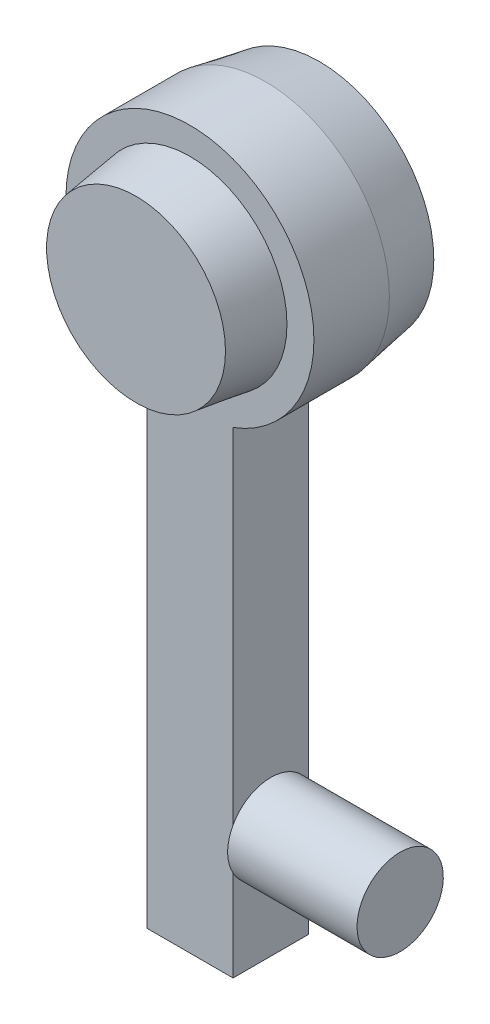
ISO-10303-21;
HEADER;
FILE_DESCRIPTION(('STEP AP214'),'2;1');
FILE_NAME('part.step','',(''),(''),'','','');
FILE_SCHEMA(('AUTOMOTIVE_DESIGN { 1 0 10303 214 1 1 1 1 }'));
ENDSEC;
DATA;
#1=APPLICATION_CONTEXT('core data for automotive mechanical design processes');
#2=APPLICATION_PROTOCOL_DEFINITION('international standard','automotive_design',2000,#1);
#3=PRODUCT_CONTEXT('',#1,'mechanical');
#4=PRODUCT('Part','Part','',(#3));
#5=PRODUCT_RELATED_PRODUCT_CATEGORY('part','',(#4));
#6=PRODUCT_DEFINITION_FORMATION('','',#4);
#7=PRODUCT_DEFINITION_CONTEXT('part definition',#1,'design');
#8=PRODUCT_DEFINITION('design','',#6,#7);
#9=PRODUCT_DEFINITION_SHAPE('','',#8);
#10=(LENGTH_UNIT() NAMED_UNIT(*) SI_UNIT(.MILLI.,.METRE.));
#11=(NAMED_UNIT(*) PLANE_ANGLE_UNIT() SI_UNIT($,.RADIAN.));
#12=(NAMED_UNIT(*) SI_UNIT($,.STERADIAN.) SOLID_ANGLE_UNIT());
#13=UNCERTAINTY_MEASURE_WITH_UNIT(LENGTH_MEASURE(1.E-05),#10,'distance_accuracy_value','');
#14=(GEOMETRIC_REPRESENTATION_CONTEXT(3) GLOBAL_UNCERTAINTY_ASSIGNED_CONTEXT((#13)) GLOBAL_UNIT_ASSIGNED_CONTEXT((#10,
#11,#12)) REPRESENTATION_CONTEXT('',''));
#15=CARTESIAN_POINT('',(0.,0.,0.));
#16=DIRECTION('',(0.,0.,1.));
#17=DIRECTION('',(1.,0.,0.));
#18=AXIS2_PLACEMENT_3D('',#15,#16,#17);
#19=CARTESIAN_POINT('',(4.,-10.7819293264239,-7.));
#20=DIRECTION('',(1.,0.,0.));
#21=DIRECTION('',(0.,1.,0.));
#22=AXIS2_PLACEMENT_3D('',#19,#20,#21);
#23=PLANE('',#22);
#24=DIRECTION('',(0.,1.,0.));
#25=VECTOR('',#24,1.);
#26=CARTESIAN_POINT('',(4.,-10.7819293264239,-7.));
#27=LINE('',#26,#25);
#28=CARTESIAN_POINT('',(4.00000000000001,-55.,-7.));
#29=VERTEX_POINT('',#28);
#30=CARTESIAN_POINT('',(4.00000000000001,-46.5764916731037,-7.));
#31=VERTEX_POINT('',#30);
#32=EDGE_CURVE('E115',#29,#31,#27,.T.);
#33=ORIENTED_EDGE('',*,*,#32,.T.);
#34=CARTESIAN_POINT('',(4.00000000000001,-44.64,-3.5));
#35=DIRECTION('',(1.,0.,0.));
#36=DIRECTION('',(0.,1.,0.));
#37=AXIS2_PLACEMENT_3D('',#34,#35,#36);
#38=CIRCLE('',#37,4.);
#39=CARTESIAN_POINT('',(4.00000000000001,-46.5764916731037,0.));
#40=VERTEX_POINT('',#39);
#41=EDGE_CURVE('E108',#40,#31,#38,.T.);
#42=ORIENTED_EDGE('',*,*,#41,.F.);
#43=DIRECTION('',(0.,1.,0.));
#44=VECTOR('',#43,1.);
#45=CARTESIAN_POINT('',(4.,-10.7819293264239,0.));
#46=LINE('',#45,#44);
#47=CARTESIAN_POINT('',(4.00000000000001,-55.,0.));
#48=VERTEX_POINT('',#47);
#49=EDGE_CURVE('E101',#48,#40,#46,.T.);
#50=ORIENTED_EDGE('',*,*,#49,.F.);
#51=DIRECTION('',(0.,0.,1.));
#52=VECTOR('',#51,1.);
#53=CARTESIAN_POINT('',(4.00000000000001,-55.,-7.));
#54=LINE('',#53,#52);
#55=EDGE_CURVE('E59',#29,#48,#54,.T.);
#56=ORIENTED_EDGE('',*,*,#55,.F.);
#57=EDGE_LOOP('',(#33,#42,#50,#56));
#58=FACE_BOUND('',#57,.T.);
#59=ADVANCED_FACE('F34',(#58),#23,.T.);
#60=CARTESIAN_POINT('',(0.,0.,-7.));
#61=DIRECTION('',(0.,0.,1.));
#62=DIRECTION('',(1.,0.,0.));
#63=AXIS2_PLACEMENT_3D('',#60,#61,#62);
#64=PLANE('',#63);
#65=CARTESIAN_POINT('',(0.,0.,-7.));
#66=DIRECTION('',(0.,0.,-1.));
#67=DIRECTION('',(-1.,0.,0.));
#68=AXIS2_PLACEMENT_3D('',#65,#66,#67);
#69=CIRCLE('',#68,11.5);
#70=CARTESIAN_POINT('',(4.,-10.7819293264239,-7.));
#71=VERTEX_POINT('',#70);
#72=CARTESIAN_POINT('',(-4.,-10.7819293264239,-7.));
#73=VERTEX_POINT('',#72);
#74=EDGE_CURVE('E86',#71,#73,#69,.T.);
#75=ORIENTED_EDGE('',*,*,#74,.F.);
#76=CARTESIAN_POINT('',(4.00000000000001,-42.7035083268963,-7.));
#77=VERTEX_POINT('',#76);
#78=EDGE_CURVE('E135',#77,#71,#27,.T.);
#79=ORIENTED_EDGE('',*,*,#78,.F.);
#80=DIRECTION('',(0.,1.,0.));
#81=VECTOR('',#80,1.);
#82=CARTESIAN_POINT('',(4.,0.,-7.));
#83=LINE('',#82,#81);
#84=EDGE_CURVE('E146',#31,#77,#83,.T.);
#85=ORIENTED_EDGE('',*,*,#84,.F.);
#86=ORIENTED_EDGE('',*,*,#32,.F.);
#87=DIRECTION('',(1.,0.,0.));
#88=VECTOR('',#87,1.);
#89=CARTESIAN_POINT('',(-3.99999999999999,-55.,-7.));
#90=LINE('',#89,#88);
#91=CARTESIAN_POINT('',(-3.99999999999999,-55.,-7.));
#92=VERTEX_POINT('',#91);
#93=EDGE_CURVE('E136',#92,#29,#90,.T.);
#94=ORIENTED_EDGE('',*,*,#93,.F.);
#95=DIRECTION('',(0.,-1.,0.));
#96=VECTOR('',#95,1.);
#97=CARTESIAN_POINT('',(-4.,-10.7819293264239,-7.));
#98=LINE('',#97,#96);
#99=EDGE_CURVE('E124',#73,#92,#98,.T.);
#100=ORIENTED_EDGE('',*,*,#99,.F.);
#101=EDGE_LOOP('',(#75,#79,#85,#86,#94,#100));
#102=FACE_BOUND('',#101,.T.);
#103=ADVANCED_FACE('F183',(#102),#64,.F.);
#104=CARTESIAN_POINT('',(0.,0.,-7.));
#105=DIRECTION('',(0.,0.,1.));
#106=DIRECTION('',(1.,0.,0.));
#107=AXIS2_PLACEMENT_3D('',#104,#105,#106);
#108=CYLINDRICAL_SURFACE('',#107,11.5);
#109=CARTESIAN_POINT('',(0.,0.,0.));
#110=DIRECTION('',(0.,0.,1.));
#111=DIRECTION('',(1.,0.,0.));
#112=AXIS2_PLACEMENT_3D('',#109,#110,#111);
#113=CIRCLE('',#112,11.5);
#114=CARTESIAN_POINT('',(4.,-10.7819293264239,0.));
#115=VERTEX_POINT('',#114);
#116=CARTESIAN_POINT('',(-4.,-10.7819293264239,0.));
#117=VERTEX_POINT('',#116);
#118=EDGE_CURVE('E129',#115,#117,#113,.T.);
#119=ORIENTED_EDGE('',*,*,#118,.F.);
#120=DIRECTION('',(0.,0.,1.));
#121=VECTOR('',#120,1.);
#122=CARTESIAN_POINT('',(4.,-10.7819293264239,-7.));
#123=LINE('',#122,#121);
#124=EDGE_CURVE('E43',#71,#115,#123,.T.);
#125=ORIENTED_EDGE('',*,*,#124,.F.);
#126=CARTESIAN_POINT('',(0.,0.,-7.));
#127=DIRECTION('',(0.,0.,1.));
#128=DIRECTION('',(1.,0.,0.));
#129=AXIS2_PLACEMENT_3D('',#126,#127,#128);
#130=CIRCLE('',#129,11.5);
#131=EDGE_CURVE('E122',#71,#73,#130,.T.);
#132=ORIENTED_EDGE('',*,*,#131,.T.);
#133=DIRECTION('',(0.,0.,1.));
#134=VECTOR('',#133,1.);
#135=CARTESIAN_POINT('',(-4.,-10.7819293264239,-7.));
#136=LINE('',#135,#134);
#137=EDGE_CURVE('E38',#73,#117,#136,.T.);
#138=ORIENTED_EDGE('',*,*,#137,.T.);
#139=EDGE_LOOP('',(#119,#125,#132,#138));
#140=FACE_BOUND('',#139,.T.);
#141=ADVANCED_FACE('F36',(#140),#108,.T.);
#142=CARTESIAN_POINT('',(4.00000000000001,-42.7035083268963,0.));
#143=VERTEX_POINT('',#142);
#144=EDGE_CURVE('E80',#143,#115,#46,.T.);
#145=ORIENTED_EDGE('',*,*,#144,.F.);
#146=EDGE_CURVE('E111',#77,#143,#38,.T.);
#147=ORIENTED_EDGE('',*,*,#146,.F.);
#148=ORIENTED_EDGE('',*,*,#78,.T.);
#149=ORIENTED_EDGE('',*,*,#124,.T.);
#150=EDGE_LOOP('',(#145,#147,#148,#149));
#151=FACE_BOUND('',#150,.T.);
#152=ADVANCED_FACE('F185',(#151),#23,.T.);
#153=CARTESIAN_POINT('',(-3.99999999999999,-55.,-7.));
#154=DIRECTION('',(0.,-1.,0.));
#155=DIRECTION('',(0.,0.,-1.));
#156=AXIS2_PLACEMENT_3D('',#153,#154,#155);
#157=PLANE('',#156);
#158=DIRECTION('',(1.,0.,0.));
#159=VECTOR('',#158,1.);
#160=CARTESIAN_POINT('',(-3.99999999999999,-55.,0.));
#161=LINE('',#160,#159);
#162=CARTESIAN_POINT('',(-3.99999999999999,-55.,0.));
#163=VERTEX_POINT('',#162);
#164=EDGE_CURVE('E121',#163,#48,#161,.T.);
#165=ORIENTED_EDGE('',*,*,#164,.F.);
#166=DIRECTION('',(0.,0.,1.));
#167=VECTOR('',#166,1.);
#168=CARTESIAN_POINT('',(-3.99999999999999,-55.,-7.));
#169=LINE('',#168,#167);
#170=EDGE_CURVE('E209',#92,#163,#169,.T.);
#171=ORIENTED_EDGE('',*,*,#170,.F.);
#172=ORIENTED_EDGE('',*,*,#93,.T.);
#173=ORIENTED_EDGE('',*,*,#55,.T.);
#174=EDGE_LOOP('',(#165,#171,#172,#173));
#175=FACE_BOUND('',#174,.T.);
#176=ADVANCED_FACE('F194',(#175),#157,.T.);
#177=CARTESIAN_POINT('',(-4.,-10.7819293264239,-7.));
#178=DIRECTION('',(-1.,0.,0.));
#179=DIRECTION('',(0.,-1.,0.));
#180=AXIS2_PLACEMENT_3D('',#177,#178,#179);
#181=PLANE('',#180);
#182=DIRECTION('',(0.,-1.,0.));
#183=VECTOR('',#182,1.);
#184=CARTESIAN_POINT('',(-4.,-10.7819293264239,0.));
#185=LINE('',#184,#183);
#186=EDGE_CURVE('E128',#117,#163,#185,.T.);
#187=ORIENTED_EDGE('',*,*,#186,.F.);
#188=ORIENTED_EDGE('',*,*,#137,.F.);
#189=ORIENTED_EDGE('',*,*,#99,.T.);
#190=ORIENTED_EDGE('',*,*,#170,.T.);
#191=EDGE_LOOP('',(#187,#188,#189,#190));
#192=FACE_BOUND('',#191,.T.);
#193=ADVANCED_FACE('F200',(#192),#181,.T.);
#194=CARTESIAN_POINT('',(0.,0.,0.));
#195=DIRECTION('',(0.,0.,1.));
#196=DIRECTION('',(1.,0.,0.));
#197=AXIS2_PLACEMENT_3D('',#194,#195,#196);
#198=PLANE('',#197);
#199=CARTESIAN_POINT('',(0.,0.,0.));
#200=DIRECTION('',(0.,0.,1.));
#201=DIRECTION('',(1.,0.,0.));
#202=AXIS2_PLACEMENT_3D('',#199,#200,#201);
#203=CIRCLE('',#202,9.);
#204=CARTESIAN_POINT('',(9.,0.,0.));
#205=VERTEX_POINT('',#204);
#206=EDGE_CURVE('E11',#205,#205,#203,.T.);
#207=ORIENTED_EDGE('',*,*,#206,.F.);
#208=EDGE_LOOP('',(#207));
#209=FACE_BOUND('',#208,.T.);
#210=ORIENTED_EDGE('',*,*,#118,.T.);
#211=ORIENTED_EDGE('',*,*,#186,.T.);
#212=ORIENTED_EDGE('',*,*,#164,.T.);
#213=ORIENTED_EDGE('',*,*,#49,.T.);
#214=EDGE_CURVE('E98',#40,#143,#46,.T.);
#215=ORIENTED_EDGE('',*,*,#214,.T.);
#216=ORIENTED_EDGE('',*,*,#144,.T.);
#217=EDGE_LOOP('',(#210,#211,#212,#213,#215,#216));
#218=FACE_BOUND('',#217,.T.);
#219=ADVANCED_FACE('F118',(#209,#218),#198,.T.);
#220=CARTESIAN_POINT('',(0.,0.,0.));
#221=DIRECTION('',(0.,0.,-1.));
#222=DIRECTION('',(1.,0.,0.));
#223=AXIS2_PLACEMENT_3D('',#220,#221,#222);
#224=CONICAL_SURFACE('',#223,9.,0.139626340159547);
#225=CARTESIAN_POINT('',(0.,0.,5.));
#226=DIRECTION('',(0.,0.,1.));
#227=DIRECTION('',(1.,0.,0.));
#228=AXIS2_PLACEMENT_3D('',#225,#226,#227);
#229=CIRCLE('',#228,8.29729582648804);
#230=CARTESIAN_POINT('',(8.29729582648804,0.,5.));
#231=VERTEX_POINT('',#230);
#232=EDGE_CURVE('E133',#231,#231,#229,.T.);
#233=ORIENTED_EDGE('',*,*,#232,.F.);
#234=EDGE_LOOP('',(#233));
#235=FACE_BOUND('',#234,.T.);
#236=ORIENTED_EDGE('',*,*,#206,.T.);
#237=EDGE_LOOP('',(#236));
#238=FACE_BOUND('',#237,.T.);
#239=ADVANCED_FACE('F179',(#235,#238),#224,.T.);
#240=CARTESIAN_POINT('',(0.,0.,5.));
#241=DIRECTION('',(0.,0.,1.));
#242=DIRECTION('',(1.,0.,0.));
#243=AXIS2_PLACEMENT_3D('',#240,#241,#242);
#244=PLANE('',#243);
#245=ORIENTED_EDGE('',*,*,#232,.T.);
#246=EDGE_LOOP('',(#245));
#247=FACE_BOUND('',#246,.T.);
#248=ADVANCED_FACE('F174',(#247),#244,.T.);
#249=CARTESIAN_POINT('',(0.,0.,-7.));
#250=DIRECTION('',(0.,0.,1.));
#251=DIRECTION('',(-1.,0.,0.));
#252=AXIS2_PLACEMENT_3D('',#249,#250,#251);
#253=CONICAL_SURFACE('',#252,11.5,0.174532925199433);
#254=CARTESIAN_POINT('',(0.,0.,-12.));
#255=DIRECTION('',(0.,0.,-1.));
#256=DIRECTION('',(-1.,0.,0.));
#257=AXIS2_PLACEMENT_3D('',#254,#255,#256);
#258=CIRCLE('',#257,10.6183650964577);
#259=CARTESIAN_POINT('',(-10.6183650964577,0.,-12.));
#260=VERTEX_POINT('',#259);
#261=EDGE_CURVE('E141',#260,#260,#258,.T.);
#262=ORIENTED_EDGE('',*,*,#261,.F.);
#263=EDGE_LOOP('',(#262));
#264=FACE_BOUND('',#263,.T.);
#265=ORIENTED_EDGE('',*,*,#74,.T.);
#266=ORIENTED_EDGE('',*,*,#131,.F.);
#267=EDGE_LOOP('',(#265,#266));
#268=FACE_BOUND('',#267,.T.);
#269=ADVANCED_FACE('F169',(#264,#268),#253,.T.);
#270=CARTESIAN_POINT('',(0.,0.,-12.));
#271=DIRECTION('',(0.,0.,-1.));
#272=DIRECTION('',(-1.,0.,0.));
#273=AXIS2_PLACEMENT_3D('',#270,#271,#272);
#274=PLANE('',#273);
#275=CARTESIAN_POINT('',(0.,0.,-12.));
#276=DIRECTION('',(0.,0.,-1.));
#277=DIRECTION('',(-1.,0.,0.));
#278=AXIS2_PLACEMENT_3D('',#275,#276,#277);
#279=CIRCLE('',#278,9.88163490354233);
#280=CARTESIAN_POINT('',(-9.88163490354233,0.,-12.));
#281=VERTEX_POINT('',#280);
#282=EDGE_CURVE('E150',#281,#281,#279,.T.);
#283=ORIENTED_EDGE('',*,*,#282,.F.);
#284=EDGE_LOOP('',(#283));
#285=FACE_BOUND('',#284,.T.);
#286=ORIENTED_EDGE('',*,*,#261,.T.);
#287=EDGE_LOOP('',(#286));
#288=FACE_BOUND('',#287,.T.);
#289=ADVANCED_FACE('F165',(#285,#288),#274,.T.);
#290=CARTESIAN_POINT('',(4.00000000000001,-44.64,-3.5));
#291=DIRECTION('',(1.,0.,0.));
#292=DIRECTION('',(0.,1.,0.));
#293=AXIS2_PLACEMENT_3D('',#290,#291,#292);
#294=PLANE('',#293);
#295=EDGE_CURVE('E116',#31,#77,#38,.T.);
#296=ORIENTED_EDGE('',*,*,#295,.F.);
#297=ORIENTED_EDGE('',*,*,#84,.T.);
#298=EDGE_LOOP('',(#296,#297));
#299=FACE_BOUND('',#298,.T.);
#300=ADVANCED_FACE('F168',(#299),#294,.F.);
#301=CARTESIAN_POINT('',(16.,-44.64,-3.5));
#302=DIRECTION('',(-1.,0.,0.));
#303=DIRECTION('',(0.,-1.,0.));
#304=AXIS2_PLACEMENT_3D('',#301,#302,#303);
#305=CYLINDRICAL_SURFACE('',#304,4.);
#306=CARTESIAN_POINT('',(16.,-44.64,-3.5));
#307=DIRECTION('',(1.,0.,0.));
#308=DIRECTION('',(0.,1.,0.));
#309=AXIS2_PLACEMENT_3D('',#306,#307,#308);
#310=CIRCLE('',#309,4.);
#311=CARTESIAN_POINT('',(16.,-40.64,-3.5));
#312=VERTEX_POINT('',#311);
#313=EDGE_CURVE('E112',#312,#312,#310,.T.);
#314=ORIENTED_EDGE('',*,*,#313,.F.);
#315=EDGE_LOOP('',(#314));
#316=FACE_BOUND('',#315,.T.);
#317=EDGE_CURVE('E50',#143,#40,#38,.T.);
#318=ORIENTED_EDGE('',*,*,#317,.T.);
#319=ORIENTED_EDGE('',*,*,#41,.T.);
#320=ORIENTED_EDGE('',*,*,#295,.T.);
#321=ORIENTED_EDGE('',*,*,#146,.T.);
#322=EDGE_LOOP('',(#318,#319,#320,#321));
#323=FACE_BOUND('',#322,.T.);
#324=ADVANCED_FACE('F106',(#316,#323),#305,.T.);
#325=CARTESIAN_POINT('',(16.,-44.64,-3.5));
#326=DIRECTION('',(1.,0.,0.));
#327=DIRECTION('',(0.,1.,0.));
#328=AXIS2_PLACEMENT_3D('',#325,#326,#327);
#329=PLANE('',#328);
#330=ORIENTED_EDGE('',*,*,#313,.T.);
#331=EDGE_LOOP('',(#330));
#332=FACE_BOUND('',#331,.T.);
#333=ADVANCED_FACE('F218',(#332),#329,.T.);
#334=ORIENTED_EDGE('',*,*,#214,.F.);
#335=ORIENTED_EDGE('',*,*,#317,.F.);
#336=EDGE_LOOP('',(#334,#335));
#337=FACE_BOUND('',#336,.T.);
#338=ADVANCED_FACE('F99',(#337),#294,.F.);
#339=CARTESIAN_POINT('',(0.,0.,-7.));
#340=DIRECTION('',(0.,0.,-1.));
#341=DIRECTION('',(-1.,0.,0.));
#342=AXIS2_PLACEMENT_3D('',#339,#340,#341);
#343=CONICAL_SURFACE('',#342,9.,0.174532925199433);
#344=CARTESIAN_POINT('',(0.,0.,-7.));
#345=DIRECTION('',(0.,0.,-1.));
#346=DIRECTION('',(-1.,0.,0.));
#347=AXIS2_PLACEMENT_3D('',#344,#345,#346);
#348=CIRCLE('',#347,9.);
#349=CARTESIAN_POINT('',(-9.,0.,-7.));
#350=VERTEX_POINT('',#349);
#351=EDGE_CURVE('E153',#350,#350,#348,.T.);
#352=ORIENTED_EDGE('',*,*,#351,.F.);
#353=EDGE_LOOP('',(#352));
#354=FACE_BOUND('',#353,.T.);
#355=ORIENTED_EDGE('',*,*,#282,.T.);
#356=EDGE_LOOP('',(#355));
#357=FACE_BOUND('',#356,.T.);
#358=ADVANCED_FACE('F159',(#354,#357),#343,.F.);
#359=CARTESIAN_POINT('',(0.,0.,-7.));
#360=DIRECTION('',(0.,0.,1.));
#361=DIRECTION('',(1.,0.,0.));
#362=AXIS2_PLACEMENT_3D('',#359,#360,#361);
#363=PLANE('',#362);
#364=ORIENTED_EDGE('',*,*,#351,.T.);
#365=EDGE_LOOP('',(#364));
#366=FACE_BOUND('',#365,.T.);
#367=ADVANCED_FACE('F157',(#366),#363,.F.);
#368=CLOSED_SHELL('',(#59,#103,#141,#152,#176,#193,#219,#239,#248,#269,#289,#300,#324,#333,#338,
#358,#367));
#369=MANIFOLD_SOLID_BREP('B2',#368);
#370=ADVANCED_BREP_SHAPE_REPRESENTATION('',(#18,#369),#14);
#371=SHAPE_DEFINITION_REPRESENTATION(#9,#370);
ENDSEC;
END-ISO-10303-21;
